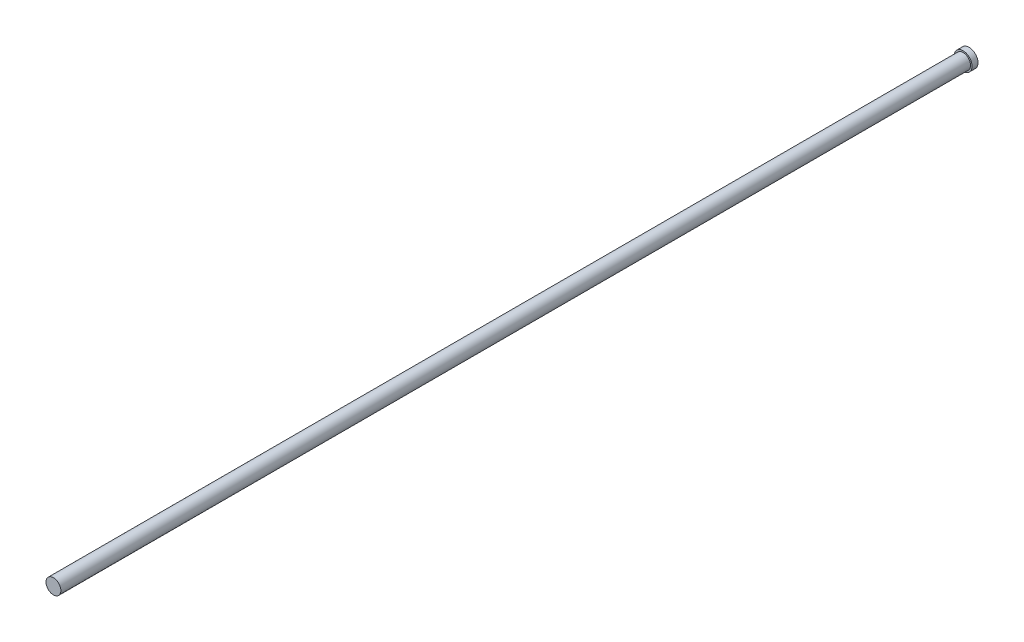
ISO-10303-21;
HEADER;
FILE_DESCRIPTION(('STEP AP214'),'2;1');
FILE_NAME('part.step','',(''),(''),'','','');
FILE_SCHEMA(('AUTOMOTIVE_DESIGN { 1 0 10303 214 1 1 1 1 }'));
ENDSEC;
DATA;
#1=APPLICATION_CONTEXT('core data for automotive mechanical design processes');
#2=APPLICATION_PROTOCOL_DEFINITION('international standard','automotive_design',2000,#1);
#3=PRODUCT_CONTEXT('',#1,'mechanical');
#4=PRODUCT('Part','Part','',(#3));
#5=PRODUCT_RELATED_PRODUCT_CATEGORY('part','',(#4));
#6=PRODUCT_DEFINITION_FORMATION('','',#4);
#7=PRODUCT_DEFINITION_CONTEXT('part definition',#1,'design');
#8=PRODUCT_DEFINITION('design','',#6,#7);
#9=PRODUCT_DEFINITION_SHAPE('','',#8);
#10=(LENGTH_UNIT() NAMED_UNIT(*) SI_UNIT(.MILLI.,.METRE.));
#11=(NAMED_UNIT(*) PLANE_ANGLE_UNIT() SI_UNIT($,.RADIAN.));
#12=(NAMED_UNIT(*) SI_UNIT($,.STERADIAN.) SOLID_ANGLE_UNIT());
#13=UNCERTAINTY_MEASURE_WITH_UNIT(LENGTH_MEASURE(1.E-05),#10,'distance_accuracy_value','');
#14=(GEOMETRIC_REPRESENTATION_CONTEXT(3) GLOBAL_UNCERTAINTY_ASSIGNED_CONTEXT((#13)) GLOBAL_UNIT_ASSIGNED_CONTEXT((#10,
#11,#12)) REPRESENTATION_CONTEXT('',''));
#15=CARTESIAN_POINT('',(0.,0.,0.));
#16=DIRECTION('',(0.,0.,1.));
#17=DIRECTION('',(1.,0.,0.));
#18=AXIS2_PLACEMENT_3D('',#15,#16,#17);
#19=CARTESIAN_POINT('',(-13.0869031863445,5.5491891992404,305.));
#20=DIRECTION('',(0.,0.,-1.));
#21=DIRECTION('',(-1.,0.,0.));
#22=AXIS2_PLACEMENT_3D('',#19,#20,#21);
#23=CYLINDRICAL_SURFACE('',#22,2.5);
#24=CARTESIAN_POINT('',(-13.0869031863445,5.5491891992404,305.));
#25=DIRECTION('',(0.,0.,1.));
#26=DIRECTION('',(1.,0.,0.));
#27=AXIS2_PLACEMENT_3D('',#24,#25,#26);
#28=CIRCLE('',#27,2.5);
#29=CARTESIAN_POINT('',(-10.5869031863445,5.5491891992404,305.));
#30=VERTEX_POINT('',#29);
#31=EDGE_CURVE('E10',#30,#30,#28,.T.);
#32=ORIENTED_EDGE('',*,*,#31,.F.);
#33=EDGE_LOOP('',(#32));
#34=FACE_BOUND('',#33,.T.);
#35=CARTESIAN_POINT('',(-13.0869031863445,5.5491891992404,0.));
#36=DIRECTION('',(0.,0.,1.));
#37=DIRECTION('',(1.,0.,0.));
#38=AXIS2_PLACEMENT_3D('',#35,#36,#37);
#39=CIRCLE('',#38,2.5);
#40=CARTESIAN_POINT('',(-10.5869031863445,5.5491891992404,0.));
#41=VERTEX_POINT('',#40);
#42=EDGE_CURVE('E42',#41,#41,#39,.T.);
#43=ORIENTED_EDGE('',*,*,#42,.T.);
#44=EDGE_LOOP('',(#43));
#45=FACE_BOUND('',#44,.T.);
#46=ADVANCED_FACE('F39',(#34,#45),#23,.T.);
#47=CARTESIAN_POINT('',(-13.0869031863445,5.5491891992404,305.));
#48=DIRECTION('',(0.,0.,1.));
#49=DIRECTION('',(1.,0.,0.));
#50=AXIS2_PLACEMENT_3D('',#47,#48,#49);
#51=PLANE('',#50);
#52=ORIENTED_EDGE('',*,*,#31,.T.);
#53=EDGE_LOOP('',(#52));
#54=FACE_BOUND('',#53,.T.);
#55=ADVANCED_FACE('F70',(#54),#51,.T.);
#56=CARTESIAN_POINT('',(-13.0879320388451,5.56843037677855,-2.));
#57=DIRECTION('',(0.,0.,1.));
#58=DIRECTION('',(1.,0.,0.));
#59=AXIS2_PLACEMENT_3D('',#56,#57,#58);
#60=CYLINDRICAL_SURFACE('',#59,3.);
#61=CARTESIAN_POINT('',(-13.0879320388451,5.56843037677855,-2.));
#62=DIRECTION('',(0.,0.,1.));
#63=DIRECTION('',(1.,0.,0.));
#64=AXIS2_PLACEMENT_3D('',#61,#62,#63);
#65=CIRCLE('',#64,3.);
#66=CARTESIAN_POINT('',(-10.0879320388451,5.56843037677855,-2.));
#67=VERTEX_POINT('',#66);
#68=EDGE_CURVE('E49',#67,#67,#65,.T.);
#69=ORIENTED_EDGE('',*,*,#68,.T.);
#70=EDGE_LOOP('',(#69));
#71=FACE_BOUND('',#70,.T.);
#72=CARTESIAN_POINT('',(-13.0879320388451,5.56843037677855,0.));
#73=DIRECTION('',(0.,0.,1.));
#74=DIRECTION('',(1.,0.,0.));
#75=AXIS2_PLACEMENT_3D('',#72,#73,#74);
#76=CIRCLE('',#75,3.);
#77=CARTESIAN_POINT('',(-10.0879320388451,5.56843037677855,0.));
#78=VERTEX_POINT('',#77);
#79=EDGE_CURVE('E51',#78,#78,#76,.T.);
#80=ORIENTED_EDGE('',*,*,#79,.F.);
#81=EDGE_LOOP('',(#80));
#82=FACE_BOUND('',#81,.T.);
#83=ADVANCED_FACE('F57',(#71,#82),#60,.T.);
#84=CARTESIAN_POINT('',(-13.0879320388451,5.56843037677855,-2.));
#85=DIRECTION('',(0.,0.,1.));
#86=DIRECTION('',(1.,0.,0.));
#87=AXIS2_PLACEMENT_3D('',#84,#85,#86);
#88=PLANE('',#87);
#89=ORIENTED_EDGE('',*,*,#68,.F.);
#90=EDGE_LOOP('',(#89));
#91=FACE_BOUND('',#90,.T.);
#92=ADVANCED_FACE('F60',(#91),#88,.F.);
#93=CARTESIAN_POINT('',(-13.0879320388451,5.56843037677855,0.));
#94=DIRECTION('',(0.,0.,1.));
#95=DIRECTION('',(1.,0.,0.));
#96=AXIS2_PLACEMENT_3D('',#93,#94,#95);
#97=PLANE('',#96);
#98=ORIENTED_EDGE('',*,*,#42,.F.);
#99=EDGE_LOOP('',(#98));
#100=FACE_BOUND('',#99,.T.);
#101=ORIENTED_EDGE('',*,*,#79,.T.);
#102=EDGE_LOOP('',(#101));
#103=FACE_BOUND('',#102,.T.);
#104=ADVANCED_FACE('F62',(#100,#103),#97,.T.);
#105=CLOSED_SHELL('',(#46,#55,#83,#92,#104));
#106=MANIFOLD_SOLID_BREP('B2',#105);
#107=ADVANCED_BREP_SHAPE_REPRESENTATION('',(#18,#106),#14);
#108=SHAPE_DEFINITION_REPRESENTATION(#9,#107);
ENDSEC;
END-ISO-10303-21;
